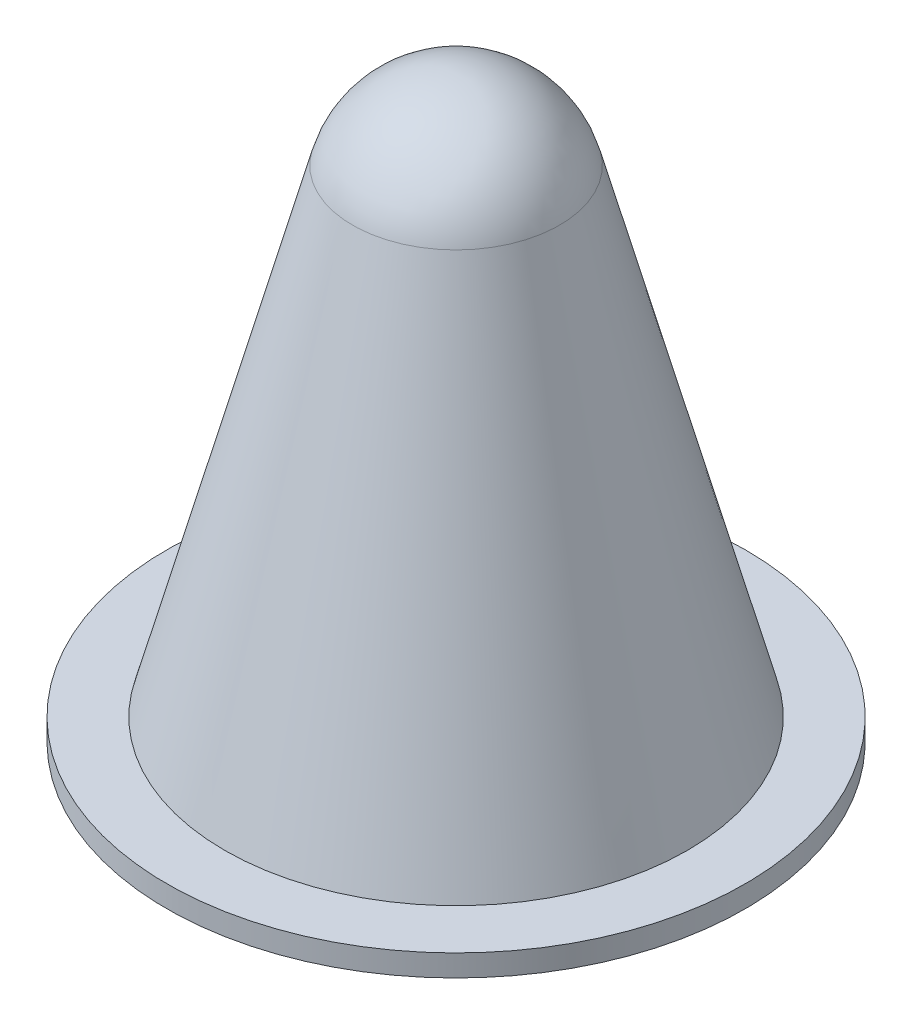
ISO-10303-21;
HEADER;
FILE_DESCRIPTION(('STEP AP214'),'2;1');
FILE_NAME('part.step','',(''),(''),'','','');
FILE_SCHEMA(('AUTOMOTIVE_DESIGN { 1 0 10303 214 1 1 1 1 }'));
ENDSEC;
DATA;
#1=APPLICATION_CONTEXT('core data for automotive mechanical design processes');
#2=APPLICATION_PROTOCOL_DEFINITION('international standard','automotive_design',2000,#1);
#3=PRODUCT_CONTEXT('',#1,'mechanical');
#4=PRODUCT('Part','Part','',(#3));
#5=PRODUCT_RELATED_PRODUCT_CATEGORY('part','',(#4));
#6=PRODUCT_DEFINITION_FORMATION('','',#4);
#7=PRODUCT_DEFINITION_CONTEXT('part definition',#1,'design');
#8=PRODUCT_DEFINITION('design','',#6,#7);
#9=PRODUCT_DEFINITION_SHAPE('','',#8);
#10=(LENGTH_UNIT() NAMED_UNIT(*) SI_UNIT(.MILLI.,.METRE.));
#11=(NAMED_UNIT(*) PLANE_ANGLE_UNIT() SI_UNIT($,.RADIAN.));
#12=(NAMED_UNIT(*) SI_UNIT($,.STERADIAN.) SOLID_ANGLE_UNIT());
#13=UNCERTAINTY_MEASURE_WITH_UNIT(LENGTH_MEASURE(1.E-05),#10,'distance_accuracy_value','');
#14=(GEOMETRIC_REPRESENTATION_CONTEXT(3) GLOBAL_UNCERTAINTY_ASSIGNED_CONTEXT((#13)) GLOBAL_UNIT_ASSIGNED_CONTEXT((#10,
#11,#12)) REPRESENTATION_CONTEXT('',''));
#15=CARTESIAN_POINT('',(0.,0.,0.));
#16=DIRECTION('',(0.,0.,1.));
#17=DIRECTION('',(1.,0.,0.));
#18=AXIS2_PLACEMENT_3D('',#15,#16,#17);
#19=CARTESIAN_POINT('',(0.,0.,0.));
#20=DIRECTION('',(0.,-1.,0.));
#21=DIRECTION('',(-1.,0.,0.));
#22=AXIS2_PLACEMENT_3D('',#19,#20,#21);
#23=SPHERICAL_SURFACE('',#22,14.8149515928606);
#24=CARTESIAN_POINT('',(0.,3.83439162450419,0.));
#25=DIRECTION('',(0.,-1.,0.));
#26=DIRECTION('',(0.,0.,-1.));
#27=AXIS2_PLACEMENT_3D('',#24,#25,#26);
#28=CIRCLE('',#27,14.3101443587664);
#29=CARTESIAN_POINT('',(0.,3.83439162450419,-14.3101443587664));
#30=VERTEX_POINT('',#29);
#31=EDGE_CURVE('E10',#30,#30,#28,.T.);
#32=ORIENTED_EDGE('',*,*,#31,.F.);
#33=EDGE_LOOP('',(#32));
#34=FACE_BOUND('',#33,.T.);
#35=ADVANCED_FACE('F39',(#34),#23,.T.);
#36=CARTESIAN_POINT('',(0.,3.83439162450419,0.));
#37=DIRECTION('',(0.,-1.,0.));
#38=DIRECTION('',(0.,0.,-1.));
#39=AXIS2_PLACEMENT_3D('',#36,#37,#38);
#40=CONICAL_SURFACE('',#39,14.3101443587664,0.261799387799146);
#41=CARTESIAN_POINT('',(0.,-62.1850484071395,0.));
#42=DIRECTION('',(0.,-1.,0.));
#43=DIRECTION('',(0.,0.,-1.));
#44=AXIS2_PLACEMENT_3D('',#41,#42,#43);
#45=CIRCLE('',#44,32.);
#46=CARTESIAN_POINT('',(0.,-62.1850484071395,-32.));
#47=VERTEX_POINT('',#46);
#48=EDGE_CURVE('E45',#47,#47,#45,.T.);
#49=ORIENTED_EDGE('',*,*,#48,.F.);
#50=EDGE_LOOP('',(#49));
#51=FACE_BOUND('',#50,.T.);
#52=ORIENTED_EDGE('',*,*,#31,.T.);
#53=EDGE_LOOP('',(#52));
#54=FACE_BOUND('',#53,.T.);
#55=ADVANCED_FACE('F69',(#51,#54),#40,.T.);
#56=CARTESIAN_POINT('',(-32.,-62.1850484071394,0.));
#57=DIRECTION('',(0.,-1.,0.));
#58=DIRECTION('',(0.,0.,-1.));
#59=AXIS2_PLACEMENT_3D('',#56,#57,#58);
#60=PLANE('',#59);
#61=CARTESIAN_POINT('',(0.,-62.1850484071394,0.));
#62=DIRECTION('',(0.,-1.,0.));
#63=DIRECTION('',(0.,0.,-1.));
#64=AXIS2_PLACEMENT_3D('',#61,#62,#63);
#65=CIRCLE('',#64,40.);
#66=CARTESIAN_POINT('',(0.,-62.1850484071394,-40.));
#67=VERTEX_POINT('',#66);
#68=EDGE_CURVE('E49',#67,#67,#65,.T.);
#69=ORIENTED_EDGE('',*,*,#68,.F.);
#70=EDGE_LOOP('',(#69));
#71=FACE_BOUND('',#70,.T.);
#72=ORIENTED_EDGE('',*,*,#48,.T.);
#73=EDGE_LOOP('',(#72));
#74=FACE_BOUND('',#73,.T.);
#75=ADVANCED_FACE('F64',(#71,#74),#60,.F.);
#76=CARTESIAN_POINT('',(0.,-65.1850484071394,0.));
#77=DIRECTION('',(0.,-1.,0.));
#78=DIRECTION('',(0.,0.,-1.));
#79=AXIS2_PLACEMENT_3D('',#76,#77,#78);
#80=CYLINDRICAL_SURFACE('',#79,40.);
#81=CARTESIAN_POINT('',(0.,-65.1850484071394,0.));
#82=DIRECTION('',(0.,-1.,0.));
#83=DIRECTION('',(0.,0.,-1.));
#84=AXIS2_PLACEMENT_3D('',#81,#82,#83);
#85=CIRCLE('',#84,40.);
#86=CARTESIAN_POINT('',(0.,-65.1850484071394,-40.));
#87=VERTEX_POINT('',#86);
#88=EDGE_CURVE('E53',#87,#87,#85,.T.);
#89=ORIENTED_EDGE('',*,*,#88,.F.);
#90=EDGE_LOOP('',(#89));
#91=FACE_BOUND('',#90,.T.);
#92=ORIENTED_EDGE('',*,*,#68,.T.);
#93=EDGE_LOOP('',(#92));
#94=FACE_BOUND('',#93,.T.);
#95=ADVANCED_FACE('F61',(#91,#94),#80,.T.);
#96=CARTESIAN_POINT('',(-40.,-65.1850484071394,0.));
#97=DIRECTION('',(0.,1.,0.));
#98=DIRECTION('',(0.,0.,1.));
#99=AXIS2_PLACEMENT_3D('',#96,#97,#98);
#100=PLANE('',#99);
#101=ORIENTED_EDGE('',*,*,#88,.T.);
#102=EDGE_LOOP('',(#101));
#103=FACE_BOUND('',#102,.T.);
#104=ADVANCED_FACE('F59',(#103),#100,.F.);
#105=CLOSED_SHELL('',(#35,#55,#75,#95,#104));
#106=MANIFOLD_SOLID_BREP('B2',#105);
#107=ADVANCED_BREP_SHAPE_REPRESENTATION('',(#18,#106),#14);
#108=SHAPE_DEFINITION_REPRESENTATION(#9,#107);
ENDSEC;
END-ISO-10303-21;
